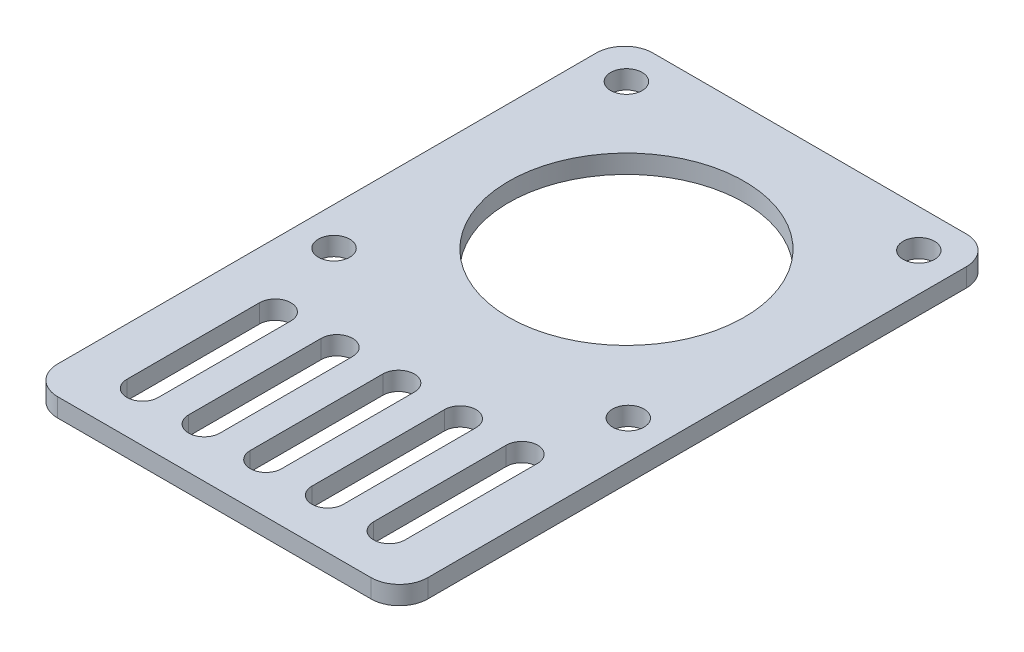
ISO-10303-21;
HEADER;
FILE_DESCRIPTION(('STEP AP214'),'2;1');
FILE_NAME('part.step','',(''),(''),'','','');
FILE_SCHEMA(('AUTOMOTIVE_DESIGN { 1 0 10303 214 1 1 1 1 }'));
ENDSEC;
DATA;
#1=APPLICATION_CONTEXT('core data for automotive mechanical design processes');
#2=APPLICATION_PROTOCOL_DEFINITION('international standard','automotive_design',2000,#1);
#3=PRODUCT_CONTEXT('',#1,'mechanical');
#4=PRODUCT('Part','Part','',(#3));
#5=PRODUCT_RELATED_PRODUCT_CATEGORY('part','',(#4));
#6=PRODUCT_DEFINITION_FORMATION('','',#4);
#7=PRODUCT_DEFINITION_CONTEXT('part definition',#1,'design');
#8=PRODUCT_DEFINITION('design','',#6,#7);
#9=PRODUCT_DEFINITION_SHAPE('','',#8);
#10=(LENGTH_UNIT() NAMED_UNIT(*) SI_UNIT(.MILLI.,.METRE.));
#11=(NAMED_UNIT(*) PLANE_ANGLE_UNIT() SI_UNIT($,.RADIAN.));
#12=(NAMED_UNIT(*) SI_UNIT($,.STERADIAN.) SOLID_ANGLE_UNIT());
#13=UNCERTAINTY_MEASURE_WITH_UNIT(LENGTH_MEASURE(1.E-05),#10,'distance_accuracy_value','');
#14=(GEOMETRIC_REPRESENTATION_CONTEXT(3) GLOBAL_UNCERTAINTY_ASSIGNED_CONTEXT((#13)) GLOBAL_UNIT_ASSIGNED_CONTEXT((#10,
#11,#12)) REPRESENTATION_CONTEXT('',''));
#15=CARTESIAN_POINT('',(0.,0.,0.));
#16=DIRECTION('',(0.,0.,1.));
#17=DIRECTION('',(1.,0.,0.));
#18=AXIS2_PLACEMENT_3D('',#15,#16,#17);
#19=CARTESIAN_POINT('',(4.6,3.,4.6));
#20=DIRECTION('',(0.,1.,0.));
#21=DIRECTION('',(0.,0.,1.));
#22=AXIS2_PLACEMENT_3D('',#19,#20,#21);
#23=PLANE('',#22);
#24=CARTESIAN_POINT('',(53.85,3.,53.25));
#25=DIRECTION('',(0.,1.,0.));
#26=DIRECTION('',(0.,0.,1.));
#27=AXIS2_PLACEMENT_3D('',#24,#25,#26);
#28=CIRCLE('',#27,2.55);
#29=CARTESIAN_POINT('',(53.85,3.,55.8));
#30=VERTEX_POINT('',#29);
#31=EDGE_CURVE('E386',#30,#30,#28,.T.);
#32=ORIENTED_EDGE('',*,*,#31,.F.);
#33=EDGE_LOOP('',(#32));
#34=FACE_BOUND('',#33,.T.);
#35=CARTESIAN_POINT('',(53.85,3.,6.15));
#36=DIRECTION('',(0.,1.,0.));
#37=DIRECTION('',(0.,0.,1.));
#38=AXIS2_PLACEMENT_3D('',#35,#36,#37);
#39=CIRCLE('',#38,2.55);
#40=CARTESIAN_POINT('',(53.85,3.,8.7));
#41=VERTEX_POINT('',#40);
#42=EDGE_CURVE('E398',#41,#41,#39,.T.);
#43=ORIENTED_EDGE('',*,*,#42,.F.);
#44=EDGE_LOOP('',(#43));
#45=FACE_BOUND('',#44,.T.);
#46=CARTESIAN_POINT('',(4.6,3.,4.6));
#47=DIRECTION('',(0.,1.,0.));
#48=DIRECTION('',(0.,0.,1.));
#49=AXIS2_PLACEMENT_3D('',#46,#47,#48);
#50=CIRCLE('',#49,4.6);
#51=CARTESIAN_POINT('',(4.60000000000003,3.,0.));
#52=VERTEX_POINT('',#51);
#53=CARTESIAN_POINT('',(0.,3.,4.60000000000003));
#54=VERTEX_POINT('',#53);
#55=EDGE_CURVE('E410',#52,#54,#50,.T.);
#56=ORIENTED_EDGE('',*,*,#55,.T.);
#57=DIRECTION('',(0.,0.,1.));
#58=VECTOR('',#57,1.);
#59=CARTESIAN_POINT('',(0.,3.,4.60000000000003));
#60=LINE('',#59,#58);
#61=CARTESIAN_POINT('',(0.,3.,91.9));
#62=VERTEX_POINT('',#61);
#63=EDGE_CURVE('E413',#54,#62,#60,.T.);
#64=ORIENTED_EDGE('',*,*,#63,.T.);
#65=CARTESIAN_POINT('',(4.60000000000001,3.,91.9));
#66=DIRECTION('',(0.,1.,0.));
#67=DIRECTION('',(0.,0.,1.));
#68=AXIS2_PLACEMENT_3D('',#65,#66,#67);
#69=CIRCLE('',#68,4.6);
#70=CARTESIAN_POINT('',(4.60000000000004,3.,96.5));
#71=VERTEX_POINT('',#70);
#72=EDGE_CURVE('E416',#62,#71,#69,.T.);
#73=ORIENTED_EDGE('',*,*,#72,.T.);
#74=DIRECTION('',(1.,0.,0.));
#75=VECTOR('',#74,1.);
#76=CARTESIAN_POINT('',(4.60000000000004,3.,96.5));
#77=LINE('',#76,#75);
#78=CARTESIAN_POINT('',(55.4,3.,96.5));
#79=VERTEX_POINT('',#78);
#80=EDGE_CURVE('E418',#71,#79,#77,.T.);
#81=ORIENTED_EDGE('',*,*,#80,.T.);
#82=CARTESIAN_POINT('',(55.4,3.,91.9));
#83=DIRECTION('',(0.,1.,0.));
#84=DIRECTION('',(0.,0.,1.));
#85=AXIS2_PLACEMENT_3D('',#82,#83,#84);
#86=CIRCLE('',#85,4.6);
#87=CARTESIAN_POINT('',(60.,3.,91.9));
#88=VERTEX_POINT('',#87);
#89=EDGE_CURVE('E420',#79,#88,#86,.T.);
#90=ORIENTED_EDGE('',*,*,#89,.T.);
#91=DIRECTION('',(0.,0.,-1.));
#92=VECTOR('',#91,1.);
#93=CARTESIAN_POINT('',(60.,3.,4.60000000000003));
#94=LINE('',#93,#92);
#95=CARTESIAN_POINT('',(60.,3.,4.60000000000003));
#96=VERTEX_POINT('',#95);
#97=EDGE_CURVE('E422',#88,#96,#94,.T.);
#98=ORIENTED_EDGE('',*,*,#97,.T.);
#99=CARTESIAN_POINT('',(55.4,3.,4.6));
#100=DIRECTION('',(0.,1.,0.));
#101=DIRECTION('',(0.,0.,-1.));
#102=AXIS2_PLACEMENT_3D('',#99,#100,#101);
#103=CIRCLE('',#102,4.6);
#104=CARTESIAN_POINT('',(55.4,3.,0.));
#105=VERTEX_POINT('',#104);
#106=EDGE_CURVE('E424',#96,#105,#103,.T.);
#107=ORIENTED_EDGE('',*,*,#106,.T.);
#108=DIRECTION('',(-1.,0.,0.));
#109=VECTOR('',#108,1.);
#110=CARTESIAN_POINT('',(4.60000000000003,3.,0.));
#111=LINE('',#110,#109);
#112=EDGE_CURVE('E426',#105,#52,#111,.T.);
#113=ORIENTED_EDGE('',*,*,#112,.T.);
#114=EDGE_LOOP('',(#56,#64,#73,#81,#90,#98,#107,#113));
#115=FACE_BOUND('',#114,.T.);
#116=CARTESIAN_POINT('',(6.45,3.,6.15));
#117=DIRECTION('',(0.,1.,0.));
#118=DIRECTION('',(0.,0.,1.));
#119=AXIS2_PLACEMENT_3D('',#116,#117,#118);
#120=CIRCLE('',#119,2.55);
#121=CARTESIAN_POINT('',(6.45,3.,8.7));
#122=VERTEX_POINT('',#121);
#123=EDGE_CURVE('E404',#122,#122,#120,.T.);
#124=ORIENTED_EDGE('',*,*,#123,.F.);
#125=EDGE_LOOP('',(#124));
#126=FACE_BOUND('',#125,.T.);
#127=CARTESIAN_POINT('',(6.15000000000001,3.,53.25));
#128=DIRECTION('',(0.,1.,0.));
#129=DIRECTION('',(0.,0.,1.));
#130=AXIS2_PLACEMENT_3D('',#127,#128,#129);
#131=CIRCLE('',#130,2.55);
#132=CARTESIAN_POINT('',(6.15000000000001,3.,55.8));
#133=VERTEX_POINT('',#132);
#134=EDGE_CURVE('E392',#133,#133,#131,.T.);
#135=ORIENTED_EDGE('',*,*,#134,.F.);
#136=EDGE_LOOP('',(#135));
#137=FACE_BOUND('',#136,.T.);
#138=CARTESIAN_POINT('',(30.,3.,29.7));
#139=DIRECTION('',(0.,1.,0.));
#140=DIRECTION('',(0.,0.,1.));
#141=AXIS2_PLACEMENT_3D('',#138,#139,#140);
#142=CIRCLE('',#141,19.1);
#143=CARTESIAN_POINT('',(30.,3.,48.8));
#144=VERTEX_POINT('',#143);
#145=EDGE_CURVE('E380',#144,#144,#142,.T.);
#146=ORIENTED_EDGE('',*,*,#145,.F.);
#147=EDGE_LOOP('',(#146));
#148=FACE_BOUND('',#147,.T.);
#149=DIRECTION('',(0.,0.,1.));
#150=VECTOR('',#149,1.);
#151=CARTESIAN_POINT('',(7.76140485262673,3.,66.95));
#152=LINE('',#151,#150);
#153=CARTESIAN_POINT('',(7.76140485262673,3.,66.95));
#154=VERTEX_POINT('',#153);
#155=CARTESIAN_POINT('',(7.76140485262673,3.,88.45));
#156=VERTEX_POINT('',#155);
#157=EDGE_CURVE('E351',#154,#156,#152,.T.);
#158=ORIENTED_EDGE('',*,*,#157,.F.);
#159=CARTESIAN_POINT('',(10.3114048526267,3.,66.95));
#160=DIRECTION('',(0.,1.,0.));
#161=DIRECTION('',(0.,0.,1.));
#162=AXIS2_PLACEMENT_3D('',#159,#160,#161);
#163=CIRCLE('',#162,2.55);
#164=CARTESIAN_POINT('',(12.8614048526267,3.,66.95));
#165=VERTEX_POINT('',#164);
#166=EDGE_CURVE('E349',#165,#154,#163,.T.);
#167=ORIENTED_EDGE('',*,*,#166,.F.);
#168=DIRECTION('',(0.,0.,-1.));
#169=VECTOR('',#168,1.);
#170=CARTESIAN_POINT('',(12.8614048526267,3.,66.95));
#171=LINE('',#170,#169);
#172=CARTESIAN_POINT('',(12.8614048526267,3.,88.45));
#173=VERTEX_POINT('',#172);
#174=EDGE_CURVE('E357',#173,#165,#171,.T.);
#175=ORIENTED_EDGE('',*,*,#174,.F.);
#176=CARTESIAN_POINT('',(10.3114048526267,3.,88.45));
#177=DIRECTION('',(0.,1.,0.));
#178=DIRECTION('',(0.,0.,1.));
#179=AXIS2_PLACEMENT_3D('',#176,#177,#178);
#180=CIRCLE('',#179,2.55);
#181=EDGE_CURVE('E354',#156,#173,#180,.T.);
#182=ORIENTED_EDGE('',*,*,#181,.F.);
#183=EDGE_LOOP('',(#158,#167,#175,#182));
#184=FACE_BOUND('',#183,.T.);
#185=DIRECTION('',(0.,0.,1.));
#186=VECTOR('',#185,1.);
#187=CARTESIAN_POINT('',(17.7614048526267,3.,66.95));
#188=LINE('',#187,#186);
#189=CARTESIAN_POINT('',(17.7614048526267,3.,66.95));
#190=VERTEX_POINT('',#189);
#191=CARTESIAN_POINT('',(17.7614048526267,3.,88.45));
#192=VERTEX_POINT('',#191);
#193=EDGE_CURVE('E320',#190,#192,#188,.T.);
#194=ORIENTED_EDGE('',*,*,#193,.F.);
#195=CARTESIAN_POINT('',(20.3114048526267,3.,66.95));
#196=DIRECTION('',(0.,1.,0.));
#197=DIRECTION('',(0.,0.,1.));
#198=AXIS2_PLACEMENT_3D('',#195,#196,#197);
#199=CIRCLE('',#198,2.55);
#200=CARTESIAN_POINT('',(22.8614048526267,3.,66.95));
#201=VERTEX_POINT('',#200);
#202=EDGE_CURVE('E318',#201,#190,#199,.T.);
#203=ORIENTED_EDGE('',*,*,#202,.F.);
#204=DIRECTION('',(0.,0.,-1.));
#205=VECTOR('',#204,1.);
#206=CARTESIAN_POINT('',(22.8614048526267,3.,66.95));
#207=LINE('',#206,#205);
#208=CARTESIAN_POINT('',(22.8614048526267,3.,88.45));
#209=VERTEX_POINT('',#208);
#210=EDGE_CURVE('E326',#209,#201,#207,.T.);
#211=ORIENTED_EDGE('',*,*,#210,.F.);
#212=CARTESIAN_POINT('',(20.3114048526267,3.,88.45));
#213=DIRECTION('',(0.,1.,0.));
#214=DIRECTION('',(0.,0.,1.));
#215=AXIS2_PLACEMENT_3D('',#212,#213,#214);
#216=CIRCLE('',#215,2.55);
#217=EDGE_CURVE('E323',#192,#209,#216,.T.);
#218=ORIENTED_EDGE('',*,*,#217,.F.);
#219=EDGE_LOOP('',(#194,#203,#211,#218));
#220=FACE_BOUND('',#219,.T.);
#221=DIRECTION('',(0.,0.,1.));
#222=VECTOR('',#221,1.);
#223=CARTESIAN_POINT('',(27.7614048526267,3.,66.95));
#224=LINE('',#223,#222);
#225=CARTESIAN_POINT('',(27.7614048526267,3.,66.95));
#226=VERTEX_POINT('',#225);
#227=CARTESIAN_POINT('',(27.7614048526267,3.,88.45));
#228=VERTEX_POINT('',#227);
#229=EDGE_CURVE('E289',#226,#228,#224,.T.);
#230=ORIENTED_EDGE('',*,*,#229,.F.);
#231=CARTESIAN_POINT('',(30.3114048526267,3.,66.95));
#232=DIRECTION('',(0.,1.,0.));
#233=DIRECTION('',(0.,0.,1.));
#234=AXIS2_PLACEMENT_3D('',#231,#232,#233);
#235=CIRCLE('',#234,2.55);
#236=CARTESIAN_POINT('',(32.8614048526267,3.,66.95));
#237=VERTEX_POINT('',#236);
#238=EDGE_CURVE('E287',#237,#226,#235,.T.);
#239=ORIENTED_EDGE('',*,*,#238,.F.);
#240=DIRECTION('',(0.,0.,-1.));
#241=VECTOR('',#240,1.);
#242=CARTESIAN_POINT('',(32.8614048526267,3.,66.95));
#243=LINE('',#242,#241);
#244=CARTESIAN_POINT('',(32.8614048526267,3.,88.45));
#245=VERTEX_POINT('',#244);
#246=EDGE_CURVE('E295',#245,#237,#243,.T.);
#247=ORIENTED_EDGE('',*,*,#246,.F.);
#248=CARTESIAN_POINT('',(30.3114048526267,3.,88.45));
#249=DIRECTION('',(0.,1.,0.));
#250=DIRECTION('',(0.,0.,1.));
#251=AXIS2_PLACEMENT_3D('',#248,#249,#250);
#252=CIRCLE('',#251,2.55);
#253=EDGE_CURVE('E292',#228,#245,#252,.T.);
#254=ORIENTED_EDGE('',*,*,#253,.F.);
#255=EDGE_LOOP('',(#230,#239,#247,#254));
#256=FACE_BOUND('',#255,.T.);
#257=DIRECTION('',(0.,0.,1.));
#258=VECTOR('',#257,1.);
#259=CARTESIAN_POINT('',(37.7614048526267,3.,66.95));
#260=LINE('',#259,#258);
#261=CARTESIAN_POINT('',(37.7614048526267,3.,66.95));
#262=VERTEX_POINT('',#261);
#263=CARTESIAN_POINT('',(37.7614048526267,3.,88.45));
#264=VERTEX_POINT('',#263);
#265=EDGE_CURVE('E258',#262,#264,#260,.T.);
#266=ORIENTED_EDGE('',*,*,#265,.F.);
#267=CARTESIAN_POINT('',(40.3114048526267,3.,66.95));
#268=DIRECTION('',(0.,1.,0.));
#269=DIRECTION('',(0.,0.,1.));
#270=AXIS2_PLACEMENT_3D('',#267,#268,#269);
#271=CIRCLE('',#270,2.55);
#272=CARTESIAN_POINT('',(42.8614048526267,3.,66.95));
#273=VERTEX_POINT('',#272);
#274=EDGE_CURVE('E256',#273,#262,#271,.T.);
#275=ORIENTED_EDGE('',*,*,#274,.F.);
#276=DIRECTION('',(0.,0.,-1.));
#277=VECTOR('',#276,1.);
#278=CARTESIAN_POINT('',(42.8614048526267,3.,66.95));
#279=LINE('',#278,#277);
#280=CARTESIAN_POINT('',(42.8614048526267,3.,88.45));
#281=VERTEX_POINT('',#280);
#282=EDGE_CURVE('E264',#281,#273,#279,.T.);
#283=ORIENTED_EDGE('',*,*,#282,.F.);
#284=CARTESIAN_POINT('',(40.3114048526267,3.,88.45));
#285=DIRECTION('',(0.,1.,0.));
#286=DIRECTION('',(0.,0.,1.));
#287=AXIS2_PLACEMENT_3D('',#284,#285,#286);
#288=CIRCLE('',#287,2.55);
#289=EDGE_CURVE('E261',#264,#281,#288,.T.);
#290=ORIENTED_EDGE('',*,*,#289,.F.);
#291=EDGE_LOOP('',(#266,#275,#283,#290));
#292=FACE_BOUND('',#291,.T.);
#293=DIRECTION('',(0.,0.,1.));
#294=VECTOR('',#293,1.);
#295=CARTESIAN_POINT('',(47.7614048526267,3.,66.95));
#296=LINE('',#295,#294);
#297=CARTESIAN_POINT('',(47.7614048526267,3.,66.95));
#298=VERTEX_POINT('',#297);
#299=CARTESIAN_POINT('',(47.7614048526267,3.,88.45));
#300=VERTEX_POINT('',#299);
#301=EDGE_CURVE('E228',#298,#300,#296,.T.);
#302=ORIENTED_EDGE('',*,*,#301,.F.);
#303=CARTESIAN_POINT('',(50.3114048526267,3.,66.95));
#304=DIRECTION('',(0.,1.,0.));
#305=DIRECTION('',(0.,0.,1.));
#306=AXIS2_PLACEMENT_3D('',#303,#304,#305);
#307=CIRCLE('',#306,2.55);
#308=CARTESIAN_POINT('',(52.8614048526267,3.,66.95));
#309=VERTEX_POINT('',#308);
#310=EDGE_CURVE('E220',#309,#298,#307,.T.);
#311=ORIENTED_EDGE('',*,*,#310,.F.);
#312=DIRECTION('',(0.,0.,-1.));
#313=VECTOR('',#312,1.);
#314=CARTESIAN_POINT('',(52.8614048526267,3.,66.95));
#315=LINE('',#314,#313);
#316=CARTESIAN_POINT('',(52.8614048526267,3.,88.45));
#317=VERTEX_POINT('',#316);
#318=EDGE_CURVE('E242',#317,#309,#315,.T.);
#319=ORIENTED_EDGE('',*,*,#318,.F.);
#320=CARTESIAN_POINT('',(50.3114048526267,3.,88.45));
#321=DIRECTION('',(0.,1.,0.));
#322=DIRECTION('',(0.,0.,1.));
#323=AXIS2_PLACEMENT_3D('',#320,#321,#322);
#324=CIRCLE('',#323,2.55);
#325=EDGE_CURVE('E240',#300,#317,#324,.T.);
#326=ORIENTED_EDGE('',*,*,#325,.F.);
#327=EDGE_LOOP('',(#302,#311,#319,#326));
#328=FACE_BOUND('',#327,.T.);
#329=ADVANCED_FACE('F35',(#34,#45,#115,#126,#137,#148,#184,#220,#256,#292,#328),#23,.T.);
#330=CARTESIAN_POINT('',(4.6,0.,4.6));
#331=DIRECTION('',(0.,1.,0.));
#332=DIRECTION('',(0.,0.,1.));
#333=AXIS2_PLACEMENT_3D('',#330,#331,#332);
#334=PLANE('',#333);
#335=CARTESIAN_POINT('',(40.3114048526267,0.,66.95));
#336=DIRECTION('',(0.,1.,0.));
#337=DIRECTION('',(0.,0.,1.));
#338=AXIS2_PLACEMENT_3D('',#335,#336,#337);
#339=CIRCLE('',#338,2.55);
#340=CARTESIAN_POINT('',(42.8614048526267,0.,66.95));
#341=VERTEX_POINT('',#340);
#342=CARTESIAN_POINT('',(37.7614048526267,0.,66.95));
#343=VERTEX_POINT('',#342);
#344=EDGE_CURVE('E236',#341,#343,#339,.T.);
#345=ORIENTED_EDGE('',*,*,#344,.T.);
#346=DIRECTION('',(0.,0.,1.));
#347=VECTOR('',#346,1.);
#348=CARTESIAN_POINT('',(37.7614048526267,0.,66.95));
#349=LINE('',#348,#347);
#350=CARTESIAN_POINT('',(37.7614048526267,0.,88.45));
#351=VERTEX_POINT('',#350);
#352=EDGE_CURVE('E269',#343,#351,#349,.T.);
#353=ORIENTED_EDGE('',*,*,#352,.T.);
#354=CARTESIAN_POINT('',(40.3114048526267,0.,88.45));
#355=DIRECTION('',(0.,1.,0.));
#356=DIRECTION('',(0.,0.,1.));
#357=AXIS2_PLACEMENT_3D('',#354,#355,#356);
#358=CIRCLE('',#357,2.55);
#359=CARTESIAN_POINT('',(42.8614048526267,0.,88.45));
#360=VERTEX_POINT('',#359);
#361=EDGE_CURVE('E272',#351,#360,#358,.T.);
#362=ORIENTED_EDGE('',*,*,#361,.T.);
#363=DIRECTION('',(0.,0.,-1.));
#364=VECTOR('',#363,1.);
#365=CARTESIAN_POINT('',(42.8614048526267,0.,66.95));
#366=LINE('',#365,#364);
#367=EDGE_CURVE('E259',#360,#341,#366,.T.);
#368=ORIENTED_EDGE('',*,*,#367,.T.);
#369=EDGE_LOOP('',(#345,#353,#362,#368));
#370=FACE_BOUND('',#369,.T.);
#371=CARTESIAN_POINT('',(20.3114048526267,0.,66.95));
#372=DIRECTION('',(0.,1.,0.));
#373=DIRECTION('',(0.,0.,1.));
#374=AXIS2_PLACEMENT_3D('',#371,#372,#373);
#375=CIRCLE('',#374,2.55);
#376=CARTESIAN_POINT('',(22.8614048526267,0.,66.95));
#377=VERTEX_POINT('',#376);
#378=CARTESIAN_POINT('',(17.7614048526267,0.,66.95));
#379=VERTEX_POINT('',#378);
#380=EDGE_CURVE('E317',#377,#379,#375,.T.);
#381=ORIENTED_EDGE('',*,*,#380,.T.);
#382=DIRECTION('',(0.,0.,1.));
#383=VECTOR('',#382,1.);
#384=CARTESIAN_POINT('',(17.7614048526267,0.,66.95));
#385=LINE('',#384,#383);
#386=CARTESIAN_POINT('',(17.7614048526267,0.,88.45));
#387=VERTEX_POINT('',#386);
#388=EDGE_CURVE('E331',#379,#387,#385,.T.);
#389=ORIENTED_EDGE('',*,*,#388,.T.);
#390=CARTESIAN_POINT('',(20.3114048526267,0.,88.45));
#391=DIRECTION('',(0.,1.,0.));
#392=DIRECTION('',(0.,0.,1.));
#393=AXIS2_PLACEMENT_3D('',#390,#391,#392);
#394=CIRCLE('',#393,2.55);
#395=CARTESIAN_POINT('',(22.8614048526267,0.,88.45));
#396=VERTEX_POINT('',#395);
#397=EDGE_CURVE('E334',#387,#396,#394,.T.);
#398=ORIENTED_EDGE('',*,*,#397,.T.);
#399=DIRECTION('',(0.,0.,-1.));
#400=VECTOR('',#399,1.);
#401=CARTESIAN_POINT('',(22.8614048526267,0.,66.95));
#402=LINE('',#401,#400);
#403=EDGE_CURVE('E321',#396,#377,#402,.T.);
#404=ORIENTED_EDGE('',*,*,#403,.T.);
#405=EDGE_LOOP('',(#381,#389,#398,#404));
#406=FACE_BOUND('',#405,.T.);
#407=CARTESIAN_POINT('',(30.,0.,29.7));
#408=DIRECTION('',(0.,1.,0.));
#409=DIRECTION('',(0.,0.,1.));
#410=AXIS2_PLACEMENT_3D('',#407,#408,#409);
#411=CIRCLE('',#410,19.1);
#412=CARTESIAN_POINT('',(30.,0.,48.8));
#413=VERTEX_POINT('',#412);
#414=EDGE_CURVE('E379',#413,#413,#411,.T.);
#415=ORIENTED_EDGE('',*,*,#414,.T.);
#416=EDGE_LOOP('',(#415));
#417=FACE_BOUND('',#416,.T.);
#418=CARTESIAN_POINT('',(53.85,0.,53.25));
#419=DIRECTION('',(0.,1.,0.));
#420=DIRECTION('',(0.,0.,1.));
#421=AXIS2_PLACEMENT_3D('',#418,#419,#420);
#422=CIRCLE('',#421,2.55);
#423=CARTESIAN_POINT('',(53.85,0.,55.8));
#424=VERTEX_POINT('',#423);
#425=EDGE_CURVE('E383',#424,#424,#422,.T.);
#426=ORIENTED_EDGE('',*,*,#425,.T.);
#427=EDGE_LOOP('',(#426));
#428=FACE_BOUND('',#427,.T.);
#429=CARTESIAN_POINT('',(6.15000000000001,0.,53.25));
#430=DIRECTION('',(0.,1.,0.));
#431=DIRECTION('',(0.,0.,1.));
#432=AXIS2_PLACEMENT_3D('',#429,#430,#431);
#433=CIRCLE('',#432,2.55);
#434=CARTESIAN_POINT('',(6.15000000000001,0.,55.8));
#435=VERTEX_POINT('',#434);
#436=EDGE_CURVE('E389',#435,#435,#433,.T.);
#437=ORIENTED_EDGE('',*,*,#436,.T.);
#438=EDGE_LOOP('',(#437));
#439=FACE_BOUND('',#438,.T.);
#440=CARTESIAN_POINT('',(53.85,0.,6.15));
#441=DIRECTION('',(0.,1.,0.));
#442=DIRECTION('',(0.,0.,1.));
#443=AXIS2_PLACEMENT_3D('',#440,#441,#442);
#444=CIRCLE('',#443,2.55);
#445=CARTESIAN_POINT('',(53.85,0.,8.7));
#446=VERTEX_POINT('',#445);
#447=EDGE_CURVE('E395',#446,#446,#444,.T.);
#448=ORIENTED_EDGE('',*,*,#447,.T.);
#449=EDGE_LOOP('',(#448));
#450=FACE_BOUND('',#449,.T.);
#451=CARTESIAN_POINT('',(6.45,0.,6.15));
#452=DIRECTION('',(0.,1.,0.));
#453=DIRECTION('',(0.,0.,1.));
#454=AXIS2_PLACEMENT_3D('',#451,#452,#453);
#455=CIRCLE('',#454,2.55);
#456=CARTESIAN_POINT('',(6.45,0.,8.7));
#457=VERTEX_POINT('',#456);
#458=EDGE_CURVE('E401',#457,#457,#455,.T.);
#459=ORIENTED_EDGE('',*,*,#458,.T.);
#460=EDGE_LOOP('',(#459));
#461=FACE_BOUND('',#460,.T.);
#462=CARTESIAN_POINT('',(4.6,0.,4.6));
#463=DIRECTION('',(0.,1.,0.));
#464=DIRECTION('',(0.,0.,1.));
#465=AXIS2_PLACEMENT_3D('',#462,#463,#464);
#466=CIRCLE('',#465,4.6);
#467=CARTESIAN_POINT('',(4.60000000000003,0.,0.));
#468=VERTEX_POINT('',#467);
#469=CARTESIAN_POINT('',(0.,0.,4.60000000000003));
#470=VERTEX_POINT('',#469);
#471=EDGE_CURVE('E407',#468,#470,#466,.T.);
#472=ORIENTED_EDGE('',*,*,#471,.F.);
#473=DIRECTION('',(-1.,0.,0.));
#474=VECTOR('',#473,1.);
#475=CARTESIAN_POINT('',(4.60000000000003,0.,0.));
#476=LINE('',#475,#474);
#477=CARTESIAN_POINT('',(55.4,0.,0.));
#478=VERTEX_POINT('',#477);
#479=EDGE_CURVE('E414',#478,#468,#476,.T.);
#480=ORIENTED_EDGE('',*,*,#479,.F.);
#481=CARTESIAN_POINT('',(55.4,0.,4.6));
#482=DIRECTION('',(0.,1.,0.));
#483=DIRECTION('',(0.,0.,-1.));
#484=AXIS2_PLACEMENT_3D('',#481,#482,#483);
#485=CIRCLE('',#484,4.6);
#486=CARTESIAN_POINT('',(60.,0.,4.60000000000003));
#487=VERTEX_POINT('',#486);
#488=EDGE_CURVE('E441',#487,#478,#485,.T.);
#489=ORIENTED_EDGE('',*,*,#488,.F.);
#490=DIRECTION('',(0.,0.,-1.));
#491=VECTOR('',#490,1.);
#492=CARTESIAN_POINT('',(60.,0.,4.60000000000003));
#493=LINE('',#492,#491);
#494=CARTESIAN_POINT('',(60.,0.,91.9));
#495=VERTEX_POINT('',#494);
#496=EDGE_CURVE('E439',#495,#487,#493,.T.);
#497=ORIENTED_EDGE('',*,*,#496,.F.);
#498=CARTESIAN_POINT('',(55.4,0.,91.9));
#499=DIRECTION('',(0.,1.,0.));
#500=DIRECTION('',(0.,0.,1.));
#501=AXIS2_PLACEMENT_3D('',#498,#499,#500);
#502=CIRCLE('',#501,4.6);
#503=CARTESIAN_POINT('',(55.4,0.,96.5));
#504=VERTEX_POINT('',#503);
#505=EDGE_CURVE('E437',#504,#495,#502,.T.);
#506=ORIENTED_EDGE('',*,*,#505,.F.);
#507=DIRECTION('',(1.,0.,0.));
#508=VECTOR('',#507,1.);
#509=CARTESIAN_POINT('',(4.60000000000004,0.,96.5));
#510=LINE('',#509,#508);
#511=CARTESIAN_POINT('',(4.60000000000004,0.,96.5));
#512=VERTEX_POINT('',#511);
#513=EDGE_CURVE('E435',#512,#504,#510,.T.);
#514=ORIENTED_EDGE('',*,*,#513,.F.);
#515=CARTESIAN_POINT('',(4.60000000000001,0.,91.9));
#516=DIRECTION('',(0.,1.,0.));
#517=DIRECTION('',(0.,0.,1.));
#518=AXIS2_PLACEMENT_3D('',#515,#516,#517);
#519=CIRCLE('',#518,4.6);
#520=CARTESIAN_POINT('',(0.,0.,91.9));
#521=VERTEX_POINT('',#520);
#522=EDGE_CURVE('E433',#521,#512,#519,.T.);
#523=ORIENTED_EDGE('',*,*,#522,.F.);
#524=DIRECTION('',(0.,0.,1.));
#525=VECTOR('',#524,1.);
#526=CARTESIAN_POINT('',(0.,0.,4.60000000000003));
#527=LINE('',#526,#525);
#528=EDGE_CURVE('E431',#470,#521,#527,.T.);
#529=ORIENTED_EDGE('',*,*,#528,.F.);
#530=EDGE_LOOP('',(#472,#480,#489,#497,#506,#514,#523,#529));
#531=FACE_BOUND('',#530,.T.);
#532=CARTESIAN_POINT('',(10.3114048526267,0.,66.95));
#533=DIRECTION('',(0.,1.,0.));
#534=DIRECTION('',(0.,0.,1.));
#535=AXIS2_PLACEMENT_3D('',#532,#533,#534);
#536=CIRCLE('',#535,2.55);
#537=CARTESIAN_POINT('',(12.8614048526267,0.,66.95));
#538=VERTEX_POINT('',#537);
#539=CARTESIAN_POINT('',(7.76140485262673,0.,66.95));
#540=VERTEX_POINT('',#539);
#541=EDGE_CURVE('E348',#538,#540,#536,.T.);
#542=ORIENTED_EDGE('',*,*,#541,.T.);
#543=DIRECTION('',(0.,0.,1.));
#544=VECTOR('',#543,1.);
#545=CARTESIAN_POINT('',(7.76140485262673,0.,66.95));
#546=LINE('',#545,#544);
#547=CARTESIAN_POINT('',(7.76140485262673,0.,88.45));
#548=VERTEX_POINT('',#547);
#549=EDGE_CURVE('E362',#540,#548,#546,.T.);
#550=ORIENTED_EDGE('',*,*,#549,.T.);
#551=CARTESIAN_POINT('',(10.3114048526267,0.,88.45));
#552=DIRECTION('',(0.,1.,0.));
#553=DIRECTION('',(0.,0.,1.));
#554=AXIS2_PLACEMENT_3D('',#551,#552,#553);
#555=CIRCLE('',#554,2.55);
#556=CARTESIAN_POINT('',(12.8614048526267,0.,88.45));
#557=VERTEX_POINT('',#556);
#558=EDGE_CURVE('E365',#548,#557,#555,.T.);
#559=ORIENTED_EDGE('',*,*,#558,.T.);
#560=DIRECTION('',(0.,0.,-1.));
#561=VECTOR('',#560,1.);
#562=CARTESIAN_POINT('',(12.8614048526267,0.,66.95));
#563=LINE('',#562,#561);
#564=EDGE_CURVE('E352',#557,#538,#563,.T.);
#565=ORIENTED_EDGE('',*,*,#564,.T.);
#566=EDGE_LOOP('',(#542,#550,#559,#565));
#567=FACE_BOUND('',#566,.T.);
#568=CARTESIAN_POINT('',(30.3114048526267,0.,66.95));
#569=DIRECTION('',(0.,1.,0.));
#570=DIRECTION('',(0.,0.,1.));
#571=AXIS2_PLACEMENT_3D('',#568,#569,#570);
#572=CIRCLE('',#571,2.55);
#573=CARTESIAN_POINT('',(32.8614048526267,0.,66.95));
#574=VERTEX_POINT('',#573);
#575=CARTESIAN_POINT('',(27.7614048526267,0.,66.95));
#576=VERTEX_POINT('',#575);
#577=EDGE_CURVE('E286',#574,#576,#572,.T.);
#578=ORIENTED_EDGE('',*,*,#577,.T.);
#579=DIRECTION('',(0.,0.,1.));
#580=VECTOR('',#579,1.);
#581=CARTESIAN_POINT('',(27.7614048526267,0.,66.95));
#582=LINE('',#581,#580);
#583=CARTESIAN_POINT('',(27.7614048526267,0.,88.45));
#584=VERTEX_POINT('',#583);
#585=EDGE_CURVE('E300',#576,#584,#582,.T.);
#586=ORIENTED_EDGE('',*,*,#585,.T.);
#587=CARTESIAN_POINT('',(30.3114048526267,0.,88.45));
#588=DIRECTION('',(0.,1.,0.));
#589=DIRECTION('',(0.,0.,1.));
#590=AXIS2_PLACEMENT_3D('',#587,#588,#589);
#591=CIRCLE('',#590,2.55);
#592=CARTESIAN_POINT('',(32.8614048526267,0.,88.45));
#593=VERTEX_POINT('',#592);
#594=EDGE_CURVE('E303',#584,#593,#591,.T.);
#595=ORIENTED_EDGE('',*,*,#594,.T.);
#596=DIRECTION('',(0.,0.,-1.));
#597=VECTOR('',#596,1.);
#598=CARTESIAN_POINT('',(32.8614048526267,0.,66.95));
#599=LINE('',#598,#597);
#600=EDGE_CURVE('E290',#593,#574,#599,.T.);
#601=ORIENTED_EDGE('',*,*,#600,.T.);
#602=EDGE_LOOP('',(#578,#586,#595,#601));
#603=FACE_BOUND('',#602,.T.);
#604=CARTESIAN_POINT('',(50.3114048526267,0.,66.95));
#605=DIRECTION('',(0.,1.,0.));
#606=DIRECTION('',(0.,0.,1.));
#607=AXIS2_PLACEMENT_3D('',#604,#605,#606);
#608=CIRCLE('',#607,2.55);
#609=CARTESIAN_POINT('',(52.8614048526267,0.,66.95));
#610=VERTEX_POINT('',#609);
#611=CARTESIAN_POINT('',(47.7614048526267,0.,66.95));
#612=VERTEX_POINT('',#611);
#613=EDGE_CURVE('E58',#610,#612,#608,.T.);
#614=ORIENTED_EDGE('',*,*,#613,.T.);
#615=DIRECTION('',(0.,0.,1.));
#616=VECTOR('',#615,1.);
#617=CARTESIAN_POINT('',(47.7614048526267,0.,66.95));
#618=LINE('',#617,#616);
#619=CARTESIAN_POINT('',(47.7614048526267,0.,88.45));
#620=VERTEX_POINT('',#619);
#621=EDGE_CURVE('E235',#612,#620,#618,.T.);
#622=ORIENTED_EDGE('',*,*,#621,.T.);
#623=CARTESIAN_POINT('',(50.3114048526267,0.,88.45));
#624=DIRECTION('',(0.,1.,0.));
#625=DIRECTION('',(0.,0.,1.));
#626=AXIS2_PLACEMENT_3D('',#623,#624,#625);
#627=CIRCLE('',#626,2.55);
#628=CARTESIAN_POINT('',(52.8614048526267,0.,88.45));
#629=VERTEX_POINT('',#628);
#630=EDGE_CURVE('E248',#620,#629,#627,.T.);
#631=ORIENTED_EDGE('',*,*,#630,.T.);
#632=DIRECTION('',(0.,0.,-1.));
#633=VECTOR('',#632,1.);
#634=CARTESIAN_POINT('',(52.8614048526267,0.,66.95));
#635=LINE('',#634,#633);
#636=EDGE_CURVE('E229',#629,#610,#635,.T.);
#637=ORIENTED_EDGE('',*,*,#636,.T.);
#638=EDGE_LOOP('',(#614,#622,#631,#637));
#639=FACE_BOUND('',#638,.T.);
#640=ADVANCED_FACE('F471',(#370,#406,#417,#428,#439,#450,#461,#531,#567,#603,#639),#334,.F.);
#641=CARTESIAN_POINT('',(4.6,3.,4.6));
#642=DIRECTION('',(0.,-1.,0.));
#643=DIRECTION('',(0.,0.,-1.));
#644=AXIS2_PLACEMENT_3D('',#641,#642,#643);
#645=CYLINDRICAL_SURFACE('',#644,4.6);
#646=ORIENTED_EDGE('',*,*,#471,.T.);
#647=DIRECTION('',(0.,-1.,0.));
#648=VECTOR('',#647,1.);
#649=CARTESIAN_POINT('',(0.,3.,4.60000000000003));
#650=LINE('',#649,#648);
#651=EDGE_CURVE('E11',#54,#470,#650,.T.);
#652=ORIENTED_EDGE('',*,*,#651,.F.);
#653=ORIENTED_EDGE('',*,*,#55,.F.);
#654=DIRECTION('',(0.,-1.,0.));
#655=VECTOR('',#654,1.);
#656=CARTESIAN_POINT('',(4.60000000000003,3.,0.));
#657=LINE('',#656,#655);
#658=EDGE_CURVE('E428',#52,#468,#657,.T.);
#659=ORIENTED_EDGE('',*,*,#658,.T.);
#660=EDGE_LOOP('',(#646,#652,#653,#659));
#661=FACE_BOUND('',#660,.T.);
#662=ADVANCED_FACE('F37',(#661),#645,.T.);
#663=CARTESIAN_POINT('',(0.,3.,4.60000000000003));
#664=DIRECTION('',(1.,0.,0.));
#665=DIRECTION('',(0.,0.,-1.));
#666=AXIS2_PLACEMENT_3D('',#663,#664,#665);
#667=PLANE('',#666);
#668=ORIENTED_EDGE('',*,*,#528,.T.);
#669=DIRECTION('',(0.,-1.,0.));
#670=VECTOR('',#669,1.);
#671=CARTESIAN_POINT('',(0.,3.,91.9));
#672=LINE('',#671,#670);
#673=EDGE_CURVE('E43',#62,#521,#672,.T.);
#674=ORIENTED_EDGE('',*,*,#673,.F.);
#675=ORIENTED_EDGE('',*,*,#63,.F.);
#676=ORIENTED_EDGE('',*,*,#651,.T.);
#677=EDGE_LOOP('',(#668,#674,#675,#676));
#678=FACE_BOUND('',#677,.T.);
#679=ADVANCED_FACE('F489',(#678),#667,.F.);
#680=CARTESIAN_POINT('',(4.60000000000001,3.,91.9));
#681=DIRECTION('',(0.,-1.,0.));
#682=DIRECTION('',(0.,0.,-1.));
#683=AXIS2_PLACEMENT_3D('',#680,#681,#682);
#684=CYLINDRICAL_SURFACE('',#683,4.6);
#685=ORIENTED_EDGE('',*,*,#522,.T.);
#686=DIRECTION('',(0.,-1.,0.));
#687=VECTOR('',#686,1.);
#688=CARTESIAN_POINT('',(4.60000000000004,3.,96.5));
#689=LINE('',#688,#687);
#690=EDGE_CURVE('E458',#71,#512,#689,.T.);
#691=ORIENTED_EDGE('',*,*,#690,.F.);
#692=ORIENTED_EDGE('',*,*,#72,.F.);
#693=ORIENTED_EDGE('',*,*,#673,.T.);
#694=EDGE_LOOP('',(#685,#691,#692,#693));
#695=FACE_BOUND('',#694,.T.);
#696=ADVANCED_FACE('F465',(#695),#684,.T.);
#697=CARTESIAN_POINT('',(4.60000000000004,3.,96.5));
#698=DIRECTION('',(0.,0.,-1.));
#699=DIRECTION('',(-1.,0.,0.));
#700=AXIS2_PLACEMENT_3D('',#697,#698,#699);
#701=PLANE('',#700);
#702=ORIENTED_EDGE('',*,*,#513,.T.);
#703=DIRECTION('',(0.,-1.,0.));
#704=VECTOR('',#703,1.);
#705=CARTESIAN_POINT('',(55.4,3.,96.5));
#706=LINE('',#705,#704);
#707=EDGE_CURVE('E455',#79,#504,#706,.T.);
#708=ORIENTED_EDGE('',*,*,#707,.F.);
#709=ORIENTED_EDGE('',*,*,#80,.F.);
#710=ORIENTED_EDGE('',*,*,#690,.T.);
#711=EDGE_LOOP('',(#702,#708,#709,#710));
#712=FACE_BOUND('',#711,.T.);
#713=ADVANCED_FACE('F477',(#712),#701,.F.);
#714=CARTESIAN_POINT('',(55.4,3.,91.9));
#715=DIRECTION('',(0.,-1.,0.));
#716=DIRECTION('',(0.,0.,-1.));
#717=AXIS2_PLACEMENT_3D('',#714,#715,#716);
#718=CYLINDRICAL_SURFACE('',#717,4.6);
#719=ORIENTED_EDGE('',*,*,#505,.T.);
#720=DIRECTION('',(0.,-1.,0.));
#721=VECTOR('',#720,1.);
#722=CARTESIAN_POINT('',(60.,3.,91.9));
#723=LINE('',#722,#721);
#724=EDGE_CURVE('E452',#88,#495,#723,.T.);
#725=ORIENTED_EDGE('',*,*,#724,.F.);
#726=ORIENTED_EDGE('',*,*,#89,.F.);
#727=ORIENTED_EDGE('',*,*,#707,.T.);
#728=EDGE_LOOP('',(#719,#725,#726,#727));
#729=FACE_BOUND('',#728,.T.);
#730=ADVANCED_FACE('F481',(#729),#718,.T.);
#731=CARTESIAN_POINT('',(60.,3.,4.60000000000003));
#732=DIRECTION('',(-1.,0.,0.));
#733=DIRECTION('',(0.,0.,1.));
#734=AXIS2_PLACEMENT_3D('',#731,#732,#733);
#735=PLANE('',#734);
#736=ORIENTED_EDGE('',*,*,#496,.T.);
#737=DIRECTION('',(0.,-1.,0.));
#738=VECTOR('',#737,1.);
#739=CARTESIAN_POINT('',(60.,3.,4.60000000000003));
#740=LINE('',#739,#738);
#741=EDGE_CURVE('E449',#96,#487,#740,.T.);
#742=ORIENTED_EDGE('',*,*,#741,.F.);
#743=ORIENTED_EDGE('',*,*,#97,.F.);
#744=ORIENTED_EDGE('',*,*,#724,.T.);
#745=EDGE_LOOP('',(#736,#742,#743,#744));
#746=FACE_BOUND('',#745,.T.);
#747=ADVANCED_FACE('F502',(#746),#735,.F.);
#748=CARTESIAN_POINT('',(55.4,3.,4.6));
#749=DIRECTION('',(0.,-1.,0.));
#750=DIRECTION('',(0.,0.,-1.));
#751=AXIS2_PLACEMENT_3D('',#748,#749,#750);
#752=CYLINDRICAL_SURFACE('',#751,4.6);
#753=ORIENTED_EDGE('',*,*,#488,.T.);
#754=DIRECTION('',(0.,-1.,0.));
#755=VECTOR('',#754,1.);
#756=CARTESIAN_POINT('',(55.4,3.,0.));
#757=LINE('',#756,#755);
#758=EDGE_CURVE('E446',#105,#478,#757,.T.);
#759=ORIENTED_EDGE('',*,*,#758,.F.);
#760=ORIENTED_EDGE('',*,*,#106,.F.);
#761=ORIENTED_EDGE('',*,*,#741,.T.);
#762=EDGE_LOOP('',(#753,#759,#760,#761));
#763=FACE_BOUND('',#762,.T.);
#764=ADVANCED_FACE('F500',(#763),#752,.T.);
#765=CARTESIAN_POINT('',(4.60000000000003,3.,0.));
#766=DIRECTION('',(0.,0.,1.));
#767=DIRECTION('',(1.,0.,0.));
#768=AXIS2_PLACEMENT_3D('',#765,#766,#767);
#769=PLANE('',#768);
#770=ORIENTED_EDGE('',*,*,#479,.T.);
#771=ORIENTED_EDGE('',*,*,#658,.F.);
#772=ORIENTED_EDGE('',*,*,#112,.F.);
#773=ORIENTED_EDGE('',*,*,#758,.T.);
#774=EDGE_LOOP('',(#770,#771,#772,#773));
#775=FACE_BOUND('',#774,.T.);
#776=ADVANCED_FACE('F495',(#775),#769,.F.);
#777=CARTESIAN_POINT('',(6.45,3.,6.15));
#778=DIRECTION('',(0.,-1.,0.));
#779=DIRECTION('',(0.,0.,-1.));
#780=AXIS2_PLACEMENT_3D('',#777,#778,#779);
#781=CYLINDRICAL_SURFACE('',#780,2.55);
#782=ORIENTED_EDGE('',*,*,#123,.T.);
#783=EDGE_LOOP('',(#782));
#784=FACE_BOUND('',#783,.T.);
#785=ORIENTED_EDGE('',*,*,#458,.F.);
#786=EDGE_LOOP('',(#785));
#787=FACE_BOUND('',#786,.T.);
#788=ADVANCED_FACE('F522',(#784,#787),#781,.F.);
#789=CARTESIAN_POINT('',(53.85,3.,6.15));
#790=DIRECTION('',(0.,-1.,0.));
#791=DIRECTION('',(0.,0.,-1.));
#792=AXIS2_PLACEMENT_3D('',#789,#790,#791);
#793=CYLINDRICAL_SURFACE('',#792,2.55);
#794=ORIENTED_EDGE('',*,*,#42,.T.);
#795=EDGE_LOOP('',(#794));
#796=FACE_BOUND('',#795,.T.);
#797=ORIENTED_EDGE('',*,*,#447,.F.);
#798=EDGE_LOOP('',(#797));
#799=FACE_BOUND('',#798,.T.);
#800=ADVANCED_FACE('F529',(#796,#799),#793,.F.);
#801=CARTESIAN_POINT('',(6.15000000000001,3.,53.25));
#802=DIRECTION('',(0.,-1.,0.));
#803=DIRECTION('',(0.,0.,-1.));
#804=AXIS2_PLACEMENT_3D('',#801,#802,#803);
#805=CYLINDRICAL_SURFACE('',#804,2.55);
#806=ORIENTED_EDGE('',*,*,#134,.T.);
#807=EDGE_LOOP('',(#806));
#808=FACE_BOUND('',#807,.T.);
#809=ORIENTED_EDGE('',*,*,#436,.F.);
#810=EDGE_LOOP('',(#809));
#811=FACE_BOUND('',#810,.T.);
#812=ADVANCED_FACE('F534',(#808,#811),#805,.F.);
#813=CARTESIAN_POINT('',(53.85,3.,53.25));
#814=DIRECTION('',(0.,-1.,0.));
#815=DIRECTION('',(0.,0.,-1.));
#816=AXIS2_PLACEMENT_3D('',#813,#814,#815);
#817=CYLINDRICAL_SURFACE('',#816,2.55);
#818=ORIENTED_EDGE('',*,*,#31,.T.);
#819=EDGE_LOOP('',(#818));
#820=FACE_BOUND('',#819,.T.);
#821=ORIENTED_EDGE('',*,*,#425,.F.);
#822=EDGE_LOOP('',(#821));
#823=FACE_BOUND('',#822,.T.);
#824=ADVANCED_FACE('F640',(#820,#823),#817,.F.);
#825=CARTESIAN_POINT('',(30.,3.,29.7));
#826=DIRECTION('',(0.,-1.,0.));
#827=DIRECTION('',(0.,0.,-1.));
#828=AXIS2_PLACEMENT_3D('',#825,#826,#827);
#829=CYLINDRICAL_SURFACE('',#828,19.1);
#830=ORIENTED_EDGE('',*,*,#145,.T.);
#831=EDGE_LOOP('',(#830));
#832=FACE_BOUND('',#831,.T.);
#833=ORIENTED_EDGE('',*,*,#414,.F.);
#834=EDGE_LOOP('',(#833));
#835=FACE_BOUND('',#834,.T.);
#836=ADVANCED_FACE('F636',(#832,#835),#829,.F.);
#837=CARTESIAN_POINT('',(10.3114048526267,3.,66.95));
#838=DIRECTION('',(0.,-1.,0.));
#839=DIRECTION('',(0.,0.,-1.));
#840=AXIS2_PLACEMENT_3D('',#837,#838,#839);
#841=CYLINDRICAL_SURFACE('',#840,2.55);
#842=ORIENTED_EDGE('',*,*,#541,.F.);
#843=DIRECTION('',(0.,-1.,0.));
#844=VECTOR('',#843,1.);
#845=CARTESIAN_POINT('',(12.8614048526267,3.,66.95));
#846=LINE('',#845,#844);
#847=EDGE_CURVE('E359',#165,#538,#846,.T.);
#848=ORIENTED_EDGE('',*,*,#847,.F.);
#849=ORIENTED_EDGE('',*,*,#166,.T.);
#850=DIRECTION('',(0.,-1.,0.));
#851=VECTOR('',#850,1.);
#852=CARTESIAN_POINT('',(7.76140485262673,3.,66.95));
#853=LINE('',#852,#851);
#854=EDGE_CURVE('E376',#154,#540,#853,.T.);
#855=ORIENTED_EDGE('',*,*,#854,.T.);
#856=EDGE_LOOP('',(#842,#848,#849,#855));
#857=FACE_BOUND('',#856,.T.);
#858=ADVANCED_FACE('F632',(#857),#841,.F.);
#859=CARTESIAN_POINT('',(7.76140485262673,3.,66.95));
#860=DIRECTION('',(1.,0.,0.));
#861=DIRECTION('',(0.,0.,-1.));
#862=AXIS2_PLACEMENT_3D('',#859,#860,#861);
#863=PLANE('',#862);
#864=ORIENTED_EDGE('',*,*,#549,.F.);
#865=ORIENTED_EDGE('',*,*,#854,.F.);
#866=ORIENTED_EDGE('',*,*,#157,.T.);
#867=DIRECTION('',(0.,-1.,0.));
#868=VECTOR('',#867,1.);
#869=CARTESIAN_POINT('',(7.76140485262673,3.,88.45));
#870=LINE('',#869,#868);
#871=EDGE_CURVE('E374',#156,#548,#870,.T.);
#872=ORIENTED_EDGE('',*,*,#871,.T.);
#873=EDGE_LOOP('',(#864,#865,#866,#872));
#874=FACE_BOUND('',#873,.T.);
#875=ADVANCED_FACE('F628',(#874),#863,.T.);
#876=CARTESIAN_POINT('',(10.3114048526267,3.,88.45));
#877=DIRECTION('',(0.,-1.,0.));
#878=DIRECTION('',(0.,0.,-1.));
#879=AXIS2_PLACEMENT_3D('',#876,#877,#878);
#880=CYLINDRICAL_SURFACE('',#879,2.55);
#881=ORIENTED_EDGE('',*,*,#558,.F.);
#882=ORIENTED_EDGE('',*,*,#871,.F.);
#883=ORIENTED_EDGE('',*,*,#181,.T.);
#884=DIRECTION('',(0.,-1.,0.));
#885=VECTOR('',#884,1.);
#886=CARTESIAN_POINT('',(12.8614048526267,3.,88.45));
#887=LINE('',#886,#885);
#888=EDGE_CURVE('E372',#173,#557,#887,.T.);
#889=ORIENTED_EDGE('',*,*,#888,.T.);
#890=EDGE_LOOP('',(#881,#882,#883,#889));
#891=FACE_BOUND('',#890,.T.);
#892=ADVANCED_FACE('F624',(#891),#880,.F.);
#893=CARTESIAN_POINT('',(12.8614048526267,3.,66.95));
#894=DIRECTION('',(-1.,0.,0.));
#895=DIRECTION('',(0.,0.,1.));
#896=AXIS2_PLACEMENT_3D('',#893,#894,#895);
#897=PLANE('',#896);
#898=ORIENTED_EDGE('',*,*,#564,.F.);
#899=ORIENTED_EDGE('',*,*,#888,.F.);
#900=ORIENTED_EDGE('',*,*,#174,.T.);
#901=ORIENTED_EDGE('',*,*,#847,.T.);
#902=EDGE_LOOP('',(#898,#899,#900,#901));
#903=FACE_BOUND('',#902,.T.);
#904=ADVANCED_FACE('F620',(#903),#897,.T.);
#905=CARTESIAN_POINT('',(20.3114048526267,3.,66.95));
#906=DIRECTION('',(0.,-1.,0.));
#907=DIRECTION('',(0.,0.,-1.));
#908=AXIS2_PLACEMENT_3D('',#905,#906,#907);
#909=CYLINDRICAL_SURFACE('',#908,2.55);
#910=ORIENTED_EDGE('',*,*,#380,.F.);
#911=DIRECTION('',(0.,-1.,0.));
#912=VECTOR('',#911,1.);
#913=CARTESIAN_POINT('',(22.8614048526267,3.,66.95));
#914=LINE('',#913,#912);
#915=EDGE_CURVE('E328',#201,#377,#914,.T.);
#916=ORIENTED_EDGE('',*,*,#915,.F.);
#917=ORIENTED_EDGE('',*,*,#202,.T.);
#918=DIRECTION('',(0.,-1.,0.));
#919=VECTOR('',#918,1.);
#920=CARTESIAN_POINT('',(17.7614048526267,3.,66.95));
#921=LINE('',#920,#919);
#922=EDGE_CURVE('E345',#190,#379,#921,.T.);
#923=ORIENTED_EDGE('',*,*,#922,.T.);
#924=EDGE_LOOP('',(#910,#916,#917,#923));
#925=FACE_BOUND('',#924,.T.);
#926=ADVANCED_FACE('F616',(#925),#909,.F.);
#927=CARTESIAN_POINT('',(17.7614048526267,3.,66.95));
#928=DIRECTION('',(1.,0.,0.));
#929=DIRECTION('',(0.,0.,-1.));
#930=AXIS2_PLACEMENT_3D('',#927,#928,#929);
#931=PLANE('',#930);
#932=ORIENTED_EDGE('',*,*,#388,.F.);
#933=ORIENTED_EDGE('',*,*,#922,.F.);
#934=ORIENTED_EDGE('',*,*,#193,.T.);
#935=DIRECTION('',(0.,-1.,0.));
#936=VECTOR('',#935,1.);
#937=CARTESIAN_POINT('',(17.7614048526267,3.,88.45));
#938=LINE('',#937,#936);
#939=EDGE_CURVE('E343',#192,#387,#938,.T.);
#940=ORIENTED_EDGE('',*,*,#939,.T.);
#941=EDGE_LOOP('',(#932,#933,#934,#940));
#942=FACE_BOUND('',#941,.T.);
#943=ADVANCED_FACE('F612',(#942),#931,.T.);
#944=CARTESIAN_POINT('',(20.3114048526267,3.,88.45));
#945=DIRECTION('',(0.,-1.,0.));
#946=DIRECTION('',(0.,0.,-1.));
#947=AXIS2_PLACEMENT_3D('',#944,#945,#946);
#948=CYLINDRICAL_SURFACE('',#947,2.55);
#949=ORIENTED_EDGE('',*,*,#397,.F.);
#950=ORIENTED_EDGE('',*,*,#939,.F.);
#951=ORIENTED_EDGE('',*,*,#217,.T.);
#952=DIRECTION('',(0.,-1.,0.));
#953=VECTOR('',#952,1.);
#954=CARTESIAN_POINT('',(22.8614048526267,3.,88.45));
#955=LINE('',#954,#953);
#956=EDGE_CURVE('E341',#209,#396,#955,.T.);
#957=ORIENTED_EDGE('',*,*,#956,.T.);
#958=EDGE_LOOP('',(#949,#950,#951,#957));
#959=FACE_BOUND('',#958,.T.);
#960=ADVANCED_FACE('F608',(#959),#948,.F.);
#961=CARTESIAN_POINT('',(22.8614048526267,3.,66.95));
#962=DIRECTION('',(-1.,0.,0.));
#963=DIRECTION('',(0.,0.,1.));
#964=AXIS2_PLACEMENT_3D('',#961,#962,#963);
#965=PLANE('',#964);
#966=ORIENTED_EDGE('',*,*,#403,.F.);
#967=ORIENTED_EDGE('',*,*,#956,.F.);
#968=ORIENTED_EDGE('',*,*,#210,.T.);
#969=ORIENTED_EDGE('',*,*,#915,.T.);
#970=EDGE_LOOP('',(#966,#967,#968,#969));
#971=FACE_BOUND('',#970,.T.);
#972=ADVANCED_FACE('F604',(#971),#965,.T.);
#973=CARTESIAN_POINT('',(30.3114048526267,3.,66.95));
#974=DIRECTION('',(0.,-1.,0.));
#975=DIRECTION('',(0.,0.,-1.));
#976=AXIS2_PLACEMENT_3D('',#973,#974,#975);
#977=CYLINDRICAL_SURFACE('',#976,2.55);
#978=ORIENTED_EDGE('',*,*,#577,.F.);
#979=DIRECTION('',(0.,-1.,0.));
#980=VECTOR('',#979,1.);
#981=CARTESIAN_POINT('',(32.8614048526267,3.,66.95));
#982=LINE('',#981,#980);
#983=EDGE_CURVE('E297',#237,#574,#982,.T.);
#984=ORIENTED_EDGE('',*,*,#983,.F.);
#985=ORIENTED_EDGE('',*,*,#238,.T.);
#986=DIRECTION('',(0.,-1.,0.));
#987=VECTOR('',#986,1.);
#988=CARTESIAN_POINT('',(27.7614048526267,3.,66.95));
#989=LINE('',#988,#987);
#990=EDGE_CURVE('E314',#226,#576,#989,.T.);
#991=ORIENTED_EDGE('',*,*,#990,.T.);
#992=EDGE_LOOP('',(#978,#984,#985,#991));
#993=FACE_BOUND('',#992,.T.);
#994=ADVANCED_FACE('F600',(#993),#977,.F.);
#995=CARTESIAN_POINT('',(27.7614048526267,3.,66.95));
#996=DIRECTION('',(1.,0.,0.));
#997=DIRECTION('',(0.,0.,-1.));
#998=AXIS2_PLACEMENT_3D('',#995,#996,#997);
#999=PLANE('',#998);
#1000=ORIENTED_EDGE('',*,*,#585,.F.);
#1001=ORIENTED_EDGE('',*,*,#990,.F.);
#1002=ORIENTED_EDGE('',*,*,#229,.T.);
#1003=DIRECTION('',(0.,-1.,0.));
#1004=VECTOR('',#1003,1.);
#1005=CARTESIAN_POINT('',(27.7614048526267,3.,88.45));
#1006=LINE('',#1005,#1004);
#1007=EDGE_CURVE('E312',#228,#584,#1006,.T.);
#1008=ORIENTED_EDGE('',*,*,#1007,.T.);
#1009=EDGE_LOOP('',(#1000,#1001,#1002,#1008));
#1010=FACE_BOUND('',#1009,.T.);
#1011=ADVANCED_FACE('F596',(#1010),#999,.T.);
#1012=CARTESIAN_POINT('',(30.3114048526267,3.,88.45));
#1013=DIRECTION('',(0.,-1.,0.));
#1014=DIRECTION('',(0.,0.,-1.));
#1015=AXIS2_PLACEMENT_3D('',#1012,#1013,#1014);
#1016=CYLINDRICAL_SURFACE('',#1015,2.55);
#1017=ORIENTED_EDGE('',*,*,#594,.F.);
#1018=ORIENTED_EDGE('',*,*,#1007,.F.);
#1019=ORIENTED_EDGE('',*,*,#253,.T.);
#1020=DIRECTION('',(0.,-1.,0.));
#1021=VECTOR('',#1020,1.);
#1022=CARTESIAN_POINT('',(32.8614048526267,3.,88.45));
#1023=LINE('',#1022,#1021);
#1024=EDGE_CURVE('E310',#245,#593,#1023,.T.);
#1025=ORIENTED_EDGE('',*,*,#1024,.T.);
#1026=EDGE_LOOP('',(#1017,#1018,#1019,#1025));
#1027=FACE_BOUND('',#1026,.T.);
#1028=ADVANCED_FACE('F592',(#1027),#1016,.F.);
#1029=CARTESIAN_POINT('',(32.8614048526267,3.,66.95));
#1030=DIRECTION('',(-1.,0.,0.));
#1031=DIRECTION('',(0.,0.,1.));
#1032=AXIS2_PLACEMENT_3D('',#1029,#1030,#1031);
#1033=PLANE('',#1032);
#1034=ORIENTED_EDGE('',*,*,#600,.F.);
#1035=ORIENTED_EDGE('',*,*,#1024,.F.);
#1036=ORIENTED_EDGE('',*,*,#246,.T.);
#1037=ORIENTED_EDGE('',*,*,#983,.T.);
#1038=EDGE_LOOP('',(#1034,#1035,#1036,#1037));
#1039=FACE_BOUND('',#1038,.T.);
#1040=ADVANCED_FACE('F589',(#1039),#1033,.T.);
#1041=CARTESIAN_POINT('',(40.3114048526267,3.,66.95));
#1042=DIRECTION('',(0.,-1.,0.));
#1043=DIRECTION('',(0.,0.,-1.));
#1044=AXIS2_PLACEMENT_3D('',#1041,#1042,#1043);
#1045=CYLINDRICAL_SURFACE('',#1044,2.55);
#1046=ORIENTED_EDGE('',*,*,#344,.F.);
#1047=DIRECTION('',(0.,-1.,0.));
#1048=VECTOR('',#1047,1.);
#1049=CARTESIAN_POINT('',(42.8614048526267,3.,66.95));
#1050=LINE('',#1049,#1048);
#1051=EDGE_CURVE('E266',#273,#341,#1050,.T.);
#1052=ORIENTED_EDGE('',*,*,#1051,.F.);
#1053=ORIENTED_EDGE('',*,*,#274,.T.);
#1054=DIRECTION('',(0.,-1.,0.));
#1055=VECTOR('',#1054,1.);
#1056=CARTESIAN_POINT('',(37.7614048526267,3.,66.95));
#1057=LINE('',#1056,#1055);
#1058=EDGE_CURVE('E283',#262,#343,#1057,.T.);
#1059=ORIENTED_EDGE('',*,*,#1058,.T.);
#1060=EDGE_LOOP('',(#1046,#1052,#1053,#1059));
#1061=FACE_BOUND('',#1060,.T.);
#1062=ADVANCED_FACE('F571',(#1061),#1045,.F.);
#1063=CARTESIAN_POINT('',(37.7614048526267,3.,66.95));
#1064=DIRECTION('',(1.,0.,0.));
#1065=DIRECTION('',(0.,0.,-1.));
#1066=AXIS2_PLACEMENT_3D('',#1063,#1064,#1065);
#1067=PLANE('',#1066);
#1068=ORIENTED_EDGE('',*,*,#352,.F.);
#1069=ORIENTED_EDGE('',*,*,#1058,.F.);
#1070=ORIENTED_EDGE('',*,*,#265,.T.);
#1071=DIRECTION('',(0.,-1.,0.));
#1072=VECTOR('',#1071,1.);
#1073=CARTESIAN_POINT('',(37.7614048526267,3.,88.45));
#1074=LINE('',#1073,#1072);
#1075=EDGE_CURVE('E281',#264,#351,#1074,.T.);
#1076=ORIENTED_EDGE('',*,*,#1075,.T.);
#1077=EDGE_LOOP('',(#1068,#1069,#1070,#1076));
#1078=FACE_BOUND('',#1077,.T.);
#1079=ADVANCED_FACE('F564',(#1078),#1067,.T.);
#1080=CARTESIAN_POINT('',(40.3114048526267,3.,88.45));
#1081=DIRECTION('',(0.,-1.,0.));
#1082=DIRECTION('',(0.,0.,-1.));
#1083=AXIS2_PLACEMENT_3D('',#1080,#1081,#1082);
#1084=CYLINDRICAL_SURFACE('',#1083,2.55);
#1085=ORIENTED_EDGE('',*,*,#361,.F.);
#1086=ORIENTED_EDGE('',*,*,#1075,.F.);
#1087=ORIENTED_EDGE('',*,*,#289,.T.);
#1088=DIRECTION('',(0.,-1.,0.));
#1089=VECTOR('',#1088,1.);
#1090=CARTESIAN_POINT('',(42.8614048526267,3.,88.45));
#1091=LINE('',#1090,#1089);
#1092=EDGE_CURVE('E279',#281,#360,#1091,.T.);
#1093=ORIENTED_EDGE('',*,*,#1092,.T.);
#1094=EDGE_LOOP('',(#1085,#1086,#1087,#1093));
#1095=FACE_BOUND('',#1094,.T.);
#1096=ADVANCED_FACE('F567',(#1095),#1084,.F.);
#1097=CARTESIAN_POINT('',(42.8614048526267,3.,66.95));
#1098=DIRECTION('',(-1.,0.,0.));
#1099=DIRECTION('',(0.,0.,1.));
#1100=AXIS2_PLACEMENT_3D('',#1097,#1098,#1099);
#1101=PLANE('',#1100);
#1102=ORIENTED_EDGE('',*,*,#367,.F.);
#1103=ORIENTED_EDGE('',*,*,#1092,.F.);
#1104=ORIENTED_EDGE('',*,*,#282,.T.);
#1105=ORIENTED_EDGE('',*,*,#1051,.T.);
#1106=EDGE_LOOP('',(#1102,#1103,#1104,#1105));
#1107=FACE_BOUND('',#1106,.T.);
#1108=ADVANCED_FACE('F574',(#1107),#1101,.T.);
#1109=CARTESIAN_POINT('',(50.3114048526267,3.,66.95));
#1110=DIRECTION('',(0.,-1.,0.));
#1111=DIRECTION('',(0.,0.,-1.));
#1112=AXIS2_PLACEMENT_3D('',#1109,#1110,#1111);
#1113=CYLINDRICAL_SURFACE('',#1112,2.55);
#1114=ORIENTED_EDGE('',*,*,#613,.F.);
#1115=DIRECTION('',(0.,-1.,0.));
#1116=VECTOR('',#1115,1.);
#1117=CARTESIAN_POINT('',(52.8614048526267,3.,66.95));
#1118=LINE('',#1117,#1116);
#1119=EDGE_CURVE('E224',#309,#610,#1118,.T.);
#1120=ORIENTED_EDGE('',*,*,#1119,.F.);
#1121=ORIENTED_EDGE('',*,*,#310,.T.);
#1122=DIRECTION('',(0.,-1.,0.));
#1123=VECTOR('',#1122,1.);
#1124=CARTESIAN_POINT('',(47.7614048526267,3.,66.95));
#1125=LINE('',#1124,#1123);
#1126=EDGE_CURVE('E223',#298,#612,#1125,.T.);
#1127=ORIENTED_EDGE('',*,*,#1126,.T.);
#1128=EDGE_LOOP('',(#1114,#1120,#1121,#1127));
#1129=FACE_BOUND('',#1128,.T.);
#1130=ADVANCED_FACE('F222',(#1129),#1113,.F.);
#1131=CARTESIAN_POINT('',(47.7614048526267,3.,66.95));
#1132=DIRECTION('',(1.,0.,0.));
#1133=DIRECTION('',(0.,0.,-1.));
#1134=AXIS2_PLACEMENT_3D('',#1131,#1132,#1133);
#1135=PLANE('',#1134);
#1136=ORIENTED_EDGE('',*,*,#621,.F.);
#1137=ORIENTED_EDGE('',*,*,#1126,.F.);
#1138=ORIENTED_EDGE('',*,*,#301,.T.);
#1139=DIRECTION('',(0.,-1.,0.));
#1140=VECTOR('',#1139,1.);
#1141=CARTESIAN_POINT('',(47.7614048526267,3.,88.45));
#1142=LINE('',#1141,#1140);
#1143=EDGE_CURVE('E237',#300,#620,#1142,.T.);
#1144=ORIENTED_EDGE('',*,*,#1143,.T.);
#1145=EDGE_LOOP('',(#1136,#1137,#1138,#1144));
#1146=FACE_BOUND('',#1145,.T.);
#1147=ADVANCED_FACE('F232',(#1146),#1135,.T.);
#1148=CARTESIAN_POINT('',(50.3114048526267,3.,88.45));
#1149=DIRECTION('',(0.,-1.,0.));
#1150=DIRECTION('',(0.,0.,-1.));
#1151=AXIS2_PLACEMENT_3D('',#1148,#1149,#1150);
#1152=CYLINDRICAL_SURFACE('',#1151,2.55);
#1153=ORIENTED_EDGE('',*,*,#630,.F.);
#1154=ORIENTED_EDGE('',*,*,#1143,.F.);
#1155=ORIENTED_EDGE('',*,*,#325,.T.);
#1156=DIRECTION('',(0.,-1.,0.));
#1157=VECTOR('',#1156,1.);
#1158=CARTESIAN_POINT('',(52.8614048526267,3.,88.45));
#1159=LINE('',#1158,#1157);
#1160=EDGE_CURVE('E50',#317,#629,#1159,.T.);
#1161=ORIENTED_EDGE('',*,*,#1160,.T.);
#1162=EDGE_LOOP('',(#1153,#1154,#1155,#1161));
#1163=FACE_BOUND('',#1162,.T.);
#1164=ADVANCED_FACE('F744',(#1163),#1152,.F.);
#1165=CARTESIAN_POINT('',(52.8614048526267,3.,66.95));
#1166=DIRECTION('',(-1.,0.,0.));
#1167=DIRECTION('',(0.,0.,1.));
#1168=AXIS2_PLACEMENT_3D('',#1165,#1166,#1167);
#1169=PLANE('',#1168);
#1170=ORIENTED_EDGE('',*,*,#636,.F.);
#1171=ORIENTED_EDGE('',*,*,#1160,.F.);
#1172=ORIENTED_EDGE('',*,*,#318,.T.);
#1173=ORIENTED_EDGE('',*,*,#1119,.T.);
#1174=EDGE_LOOP('',(#1170,#1171,#1172,#1173));
#1175=FACE_BOUND('',#1174,.T.);
#1176=ADVANCED_FACE('F752',(#1175),#1169,.T.);
#1177=CLOSED_SHELL('',(#329,#640,#662,#679,#696,#713,#730,#747,#764,#776,#788,#800,#812,#824,
#836,#858,#875,#892,#904,#926,#943,#960,#972,#994,#1011,#1028,#1040,#1062,#1079,#1096,#1108,
#1130,#1147,#1164,#1176));
#1178=MANIFOLD_SOLID_BREP('B2',#1177);
#1179=ADVANCED_BREP_SHAPE_REPRESENTATION('',(#18,#1178),#14);
#1180=SHAPE_DEFINITION_REPRESENTATION(#9,#1179);
ENDSEC;
END-ISO-10303-21;
